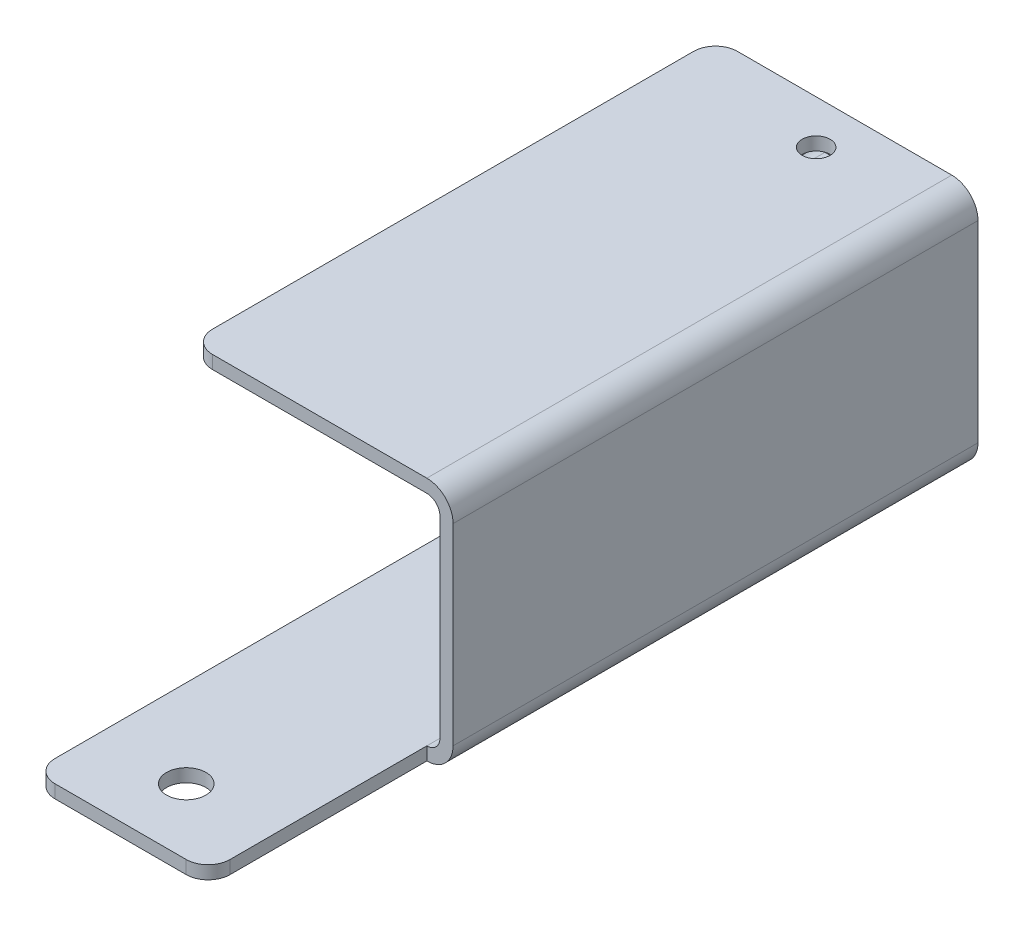
ISO-10303-21;
HEADER;
FILE_DESCRIPTION(('STEP AP214'),'2;1');
FILE_NAME('part.step','',(''),(''),'','','');
FILE_SCHEMA(('AUTOMOTIVE_DESIGN { 1 0 10303 214 1 1 1 1 }'));
ENDSEC;
DATA;
#1=APPLICATION_CONTEXT('core data for automotive mechanical design processes');
#2=APPLICATION_PROTOCOL_DEFINITION('international standard','automotive_design',2000,#1);
#3=PRODUCT_CONTEXT('',#1,'mechanical');
#4=PRODUCT('Part','Part','',(#3));
#5=PRODUCT_RELATED_PRODUCT_CATEGORY('part','',(#4));
#6=PRODUCT_DEFINITION_FORMATION('','',#4);
#7=PRODUCT_DEFINITION_CONTEXT('part definition',#1,'design');
#8=PRODUCT_DEFINITION('design','',#6,#7);
#9=PRODUCT_DEFINITION_SHAPE('','',#8);
#10=(LENGTH_UNIT() NAMED_UNIT(*) SI_UNIT(.MILLI.,.METRE.));
#11=(NAMED_UNIT(*) PLANE_ANGLE_UNIT() SI_UNIT($,.RADIAN.));
#12=(NAMED_UNIT(*) SI_UNIT($,.STERADIAN.) SOLID_ANGLE_UNIT());
#13=UNCERTAINTY_MEASURE_WITH_UNIT(LENGTH_MEASURE(1.E-05),#10,'distance_accuracy_value','');
#14=(GEOMETRIC_REPRESENTATION_CONTEXT(3) GLOBAL_UNCERTAINTY_ASSIGNED_CONTEXT((#13)) GLOBAL_UNIT_ASSIGNED_CONTEXT((#10,
#11,#12)) REPRESENTATION_CONTEXT('',''));
#15=CARTESIAN_POINT('',(0.,0.,0.));
#16=DIRECTION('',(0.,0.,1.));
#17=DIRECTION('',(1.,0.,0.));
#18=AXIS2_PLACEMENT_3D('',#15,#16,#17);
#19=CARTESIAN_POINT('',(13.,0.,-42.5));
#20=DIRECTION('',(0.,0.,1.));
#21=DIRECTION('',(-1.,0.,0.));
#22=AXIS2_PLACEMENT_3D('',#19,#20,#21);
#23=PLANE('',#22);
#24=DIRECTION('',(1.,0.,0.));
#25=VECTOR('',#24,1.);
#26=CARTESIAN_POINT('',(11.5000000000001,23.5,-42.5));
#27=LINE('',#26,#25);
#28=CARTESIAN_POINT('',(11.5000000000001,23.5,-42.5));
#29=VERTEX_POINT('',#28);
#30=CARTESIAN_POINT('',(13.0000000000001,23.5,-42.5));
#31=VERTEX_POINT('',#30);
#32=EDGE_CURVE('E304',#29,#31,#27,.T.);
#33=ORIENTED_EDGE('',*,*,#32,.T.);
#34=DIRECTION('',(0.,-1.,0.));
#35=VECTOR('',#34,1.);
#36=CARTESIAN_POINT('',(13.,0.,-42.5));
#37=LINE('',#36,#35);
#38=CARTESIAN_POINT('',(13.,1.49999999999999,-42.5));
#39=VERTEX_POINT('',#38);
#40=EDGE_CURVE('E312',#31,#39,#37,.T.);
#41=ORIENTED_EDGE('',*,*,#40,.T.);
#42=DIRECTION('',(-1.,0.,0.));
#43=VECTOR('',#42,1.);
#44=CARTESIAN_POINT('',(13.,1.49999999999999,-42.5));
#45=LINE('',#44,#43);
#46=CARTESIAN_POINT('',(11.5,1.49999999999999,-42.5));
#47=VERTEX_POINT('',#46);
#48=EDGE_CURVE('E311',#47,#39,#45,.F.);
#49=ORIENTED_EDGE('',*,*,#48,.F.);
#50=DIRECTION('',(0.,1.,0.));
#51=VECTOR('',#50,1.);
#52=CARTESIAN_POINT('',(11.5,0.,-42.5));
#53=LINE('',#52,#51);
#54=EDGE_CURVE('E316',#29,#47,#53,.F.);
#55=ORIENTED_EDGE('',*,*,#54,.F.);
#56=EDGE_LOOP('',(#33,#41,#49,#55));
#57=FACE_BOUND('',#56,.T.);
#58=ADVANCED_FACE('F39',(#57),#23,.F.);
#59=CARTESIAN_POINT('',(13.,0.,0.));
#60=DIRECTION('',(-1.,0.,0.));
#61=DIRECTION('',(0.,1.,0.));
#62=AXIS2_PLACEMENT_3D('',#59,#60,#61);
#63=PLANE('',#62);
#64=DIRECTION('',(0.,0.,1.));
#65=VECTOR('',#64,1.);
#66=CARTESIAN_POINT('',(13.,1.49999999999999,-42.5));
#67=LINE('',#66,#65);
#68=CARTESIAN_POINT('',(13.0000000000001,1.5,17.5));
#69=VERTEX_POINT('',#68);
#70=EDGE_CURVE('E319',#69,#39,#67,.F.);
#71=ORIENTED_EDGE('',*,*,#70,.T.);
#72=ORIENTED_EDGE('',*,*,#40,.F.);
#73=DIRECTION('',(0.,0.,1.));
#74=VECTOR('',#73,1.);
#75=CARTESIAN_POINT('',(13.0000000000001,23.5,42.5));
#76=LINE('',#75,#74);
#77=CARTESIAN_POINT('',(13.0000000000001,23.5,17.5));
#78=VERTEX_POINT('',#77);
#79=EDGE_CURVE('E297',#78,#31,#76,.F.);
#80=ORIENTED_EDGE('',*,*,#79,.F.);
#81=DIRECTION('',(0.,1.,0.));
#82=VECTOR('',#81,1.);
#83=CARTESIAN_POINT('',(13.0000000000001,0.,17.5));
#84=LINE('',#83,#82);
#85=EDGE_CURVE('E256',#69,#78,#84,.T.);
#86=ORIENTED_EDGE('',*,*,#85,.F.);
#87=EDGE_LOOP('',(#71,#72,#80,#86));
#88=FACE_BOUND('',#87,.T.);
#89=ADVANCED_FACE('F458',(#88),#63,.F.);
#90=CARTESIAN_POINT('',(11.5,0.,0.));
#91=DIRECTION('',(-1.,0.,0.));
#92=DIRECTION('',(0.,1.,0.));
#93=AXIS2_PLACEMENT_3D('',#90,#91,#92);
#94=PLANE('',#93);
#95=DIRECTION('',(0.,1.,0.));
#96=VECTOR('',#95,1.);
#97=CARTESIAN_POINT('',(11.5,0.,17.5));
#98=LINE('',#97,#96);
#99=CARTESIAN_POINT('',(11.5,1.49999999999999,17.5));
#100=VERTEX_POINT('',#99);
#101=CARTESIAN_POINT('',(11.5000000000001,23.5,17.5));
#102=VERTEX_POINT('',#101);
#103=EDGE_CURVE('E266',#100,#102,#98,.T.);
#104=ORIENTED_EDGE('',*,*,#103,.T.);
#105=DIRECTION('',(0.,0.,1.));
#106=VECTOR('',#105,1.);
#107=CARTESIAN_POINT('',(11.5000000000001,23.5,42.5));
#108=LINE('',#107,#106);
#109=EDGE_CURVE('E293',#102,#29,#108,.F.);
#110=ORIENTED_EDGE('',*,*,#109,.T.);
#111=ORIENTED_EDGE('',*,*,#54,.T.);
#112=DIRECTION('',(0.,0.,1.));
#113=VECTOR('',#112,1.);
#114=CARTESIAN_POINT('',(11.5,1.49999999999999,-42.5));
#115=LINE('',#114,#113);
#116=EDGE_CURVE('E322',#47,#100,#115,.T.);
#117=ORIENTED_EDGE('',*,*,#116,.T.);
#118=EDGE_LOOP('',(#104,#110,#111,#117));
#119=FACE_BOUND('',#118,.T.);
#120=ADVANCED_FACE('F433',(#119),#94,.T.);
#121=CARTESIAN_POINT('',(-10.,-1.5,42.5));
#122=DIRECTION('',(-1.,0.,0.));
#123=DIRECTION('',(0.,0.,-1.));
#124=AXIS2_PLACEMENT_3D('',#121,#122,#123);
#125=PLANE('',#124);
#126=DIRECTION('',(0.,0.,-1.));
#127=VECTOR('',#126,1.);
#128=CARTESIAN_POINT('',(-10.,0.,42.5));
#129=LINE('',#128,#127);
#130=CARTESIAN_POINT('',(-10.,0.,40.));
#131=VERTEX_POINT('',#130);
#132=CARTESIAN_POINT('',(-10.,0.,-42.5));
#133=VERTEX_POINT('',#132);
#134=EDGE_CURVE('E350',#131,#133,#129,.T.);
#135=ORIENTED_EDGE('',*,*,#134,.T.);
#136=DIRECTION('',(0.,1.,0.));
#137=VECTOR('',#136,1.);
#138=CARTESIAN_POINT('',(-10.,-1.5,-42.5));
#139=LINE('',#138,#137);
#140=CARTESIAN_POINT('',(-10.,-1.5,-42.5));
#141=VERTEX_POINT('',#140);
#142=EDGE_CURVE('E344',#141,#133,#139,.T.);
#143=ORIENTED_EDGE('',*,*,#142,.F.);
#144=DIRECTION('',(0.,0.,-1.));
#145=VECTOR('',#144,1.);
#146=CARTESIAN_POINT('',(-10.,-1.5,42.5));
#147=LINE('',#146,#145);
#148=CARTESIAN_POINT('',(-10.,-1.5,40.));
#149=VERTEX_POINT('',#148);
#150=EDGE_CURVE('E338',#149,#141,#147,.T.);
#151=ORIENTED_EDGE('',*,*,#150,.F.);
#152=DIRECTION('',(0.,1.,0.));
#153=VECTOR('',#152,1.);
#154=CARTESIAN_POINT('',(-10.,-1.5,40.));
#155=LINE('',#154,#153);
#156=EDGE_CURVE('E375',#131,#149,#155,.F.);
#157=ORIENTED_EDGE('',*,*,#156,.F.);
#158=EDGE_LOOP('',(#135,#143,#151,#157));
#159=FACE_BOUND('',#158,.T.);
#160=ADVANCED_FACE('F484',(#159),#125,.T.);
#161=CARTESIAN_POINT('',(-10.,-1.5,42.5));
#162=DIRECTION('',(0.,0.,1.));
#163=DIRECTION('',(-1.,0.,0.));
#164=AXIS2_PLACEMENT_3D('',#161,#162,#163);
#165=PLANE('',#164);
#166=DIRECTION('',(-1.,0.,0.));
#167=VECTOR('',#166,1.);
#168=CARTESIAN_POINT('',(-10.,0.,42.5));
#169=LINE('',#168,#167);
#170=CARTESIAN_POINT('',(7.5,0.,42.5));
#171=VERTEX_POINT('',#170);
#172=CARTESIAN_POINT('',(-7.5,0.,42.5));
#173=VERTEX_POINT('',#172);
#174=EDGE_CURVE('E347',#171,#173,#169,.T.);
#175=ORIENTED_EDGE('',*,*,#174,.T.);
#176=DIRECTION('',(0.,1.,0.));
#177=VECTOR('',#176,1.);
#178=CARTESIAN_POINT('',(-7.5,-1.5,42.5));
#179=LINE('',#178,#177);
#180=CARTESIAN_POINT('',(-7.5,-1.5,42.5));
#181=VERTEX_POINT('',#180);
#182=EDGE_CURVE('E364',#181,#173,#179,.T.);
#183=ORIENTED_EDGE('',*,*,#182,.F.);
#184=DIRECTION('',(-1.,0.,0.));
#185=VECTOR('',#184,1.);
#186=CARTESIAN_POINT('',(-10.,-1.5,42.5));
#187=LINE('',#186,#185);
#188=CARTESIAN_POINT('',(7.5,-1.5,42.5));
#189=VERTEX_POINT('',#188);
#190=EDGE_CURVE('E334',#189,#181,#187,.T.);
#191=ORIENTED_EDGE('',*,*,#190,.F.);
#192=DIRECTION('',(0.,1.,0.));
#193=VECTOR('',#192,1.);
#194=CARTESIAN_POINT('',(7.5,-1.5,42.5));
#195=LINE('',#194,#193);
#196=EDGE_CURVE('E367',#171,#189,#195,.F.);
#197=ORIENTED_EDGE('',*,*,#196,.F.);
#198=EDGE_LOOP('',(#175,#183,#191,#197));
#199=FACE_BOUND('',#198,.T.);
#200=ADVANCED_FACE('F479',(#199),#165,.T.);
#201=CARTESIAN_POINT('',(0.,-1.5,0.));
#202=DIRECTION('',(0.,1.,0.));
#203=DIRECTION('',(0.,0.,1.));
#204=AXIS2_PLACEMENT_3D('',#201,#202,#203);
#205=PLANE('',#204);
#206=CARTESIAN_POINT('',(0.,-1.5,35.));
#207=DIRECTION('',(0.,-1.,0.));
#208=DIRECTION('',(0.,0.,1.));
#209=AXIS2_PLACEMENT_3D('',#206,#207,#208);
#210=CIRCLE('',#209,2.25);
#211=CARTESIAN_POINT('',(0.,-1.5,37.25));
#212=VERTEX_POINT('',#211);
#213=EDGE_CURVE('E243',#212,#212,#210,.T.);
#214=ORIENTED_EDGE('',*,*,#213,.F.);
#215=EDGE_LOOP('',(#214));
#216=FACE_BOUND('',#215,.T.);
#217=ORIENTED_EDGE('',*,*,#190,.T.);
#218=CARTESIAN_POINT('',(-7.5,-1.5,40.));
#219=DIRECTION('',(0.,-1.,0.));
#220=DIRECTION('',(0.,0.,1.));
#221=AXIS2_PLACEMENT_3D('',#218,#219,#220);
#222=CIRCLE('',#221,2.5);
#223=EDGE_CURVE('E370',#149,#181,#222,.F.);
#224=ORIENTED_EDGE('',*,*,#223,.F.);
#225=ORIENTED_EDGE('',*,*,#150,.T.);
#226=DIRECTION('',(1.,0.,0.));
#227=VECTOR('',#226,1.);
#228=CARTESIAN_POINT('',(-10.,-1.5,-42.5));
#229=LINE('',#228,#227);
#230=CARTESIAN_POINT('',(10.,-1.50000000000002,-42.5));
#231=VERTEX_POINT('',#230);
#232=EDGE_CURVE('E341',#141,#231,#229,.T.);
#233=ORIENTED_EDGE('',*,*,#232,.T.);
#234=DIRECTION('',(0.,0.,1.));
#235=VECTOR('',#234,1.);
#236=CARTESIAN_POINT('',(10.,-1.5,42.5));
#237=LINE('',#236,#235);
#238=CARTESIAN_POINT('',(10.,-1.5,17.5));
#239=VERTEX_POINT('',#238);
#240=EDGE_CURVE('E331',#231,#239,#237,.T.);
#241=ORIENTED_EDGE('',*,*,#240,.T.);
#242=DIRECTION('',(0.,0.,-1.));
#243=VECTOR('',#242,1.);
#244=CARTESIAN_POINT('',(10.,-1.5,42.5));
#245=LINE('',#244,#243);
#246=CARTESIAN_POINT('',(10.,-1.5,40.));
#247=VERTEX_POINT('',#246);
#248=EDGE_CURVE('E246',#247,#239,#245,.T.);
#249=ORIENTED_EDGE('',*,*,#248,.F.);
#250=CARTESIAN_POINT('',(7.5,-1.5,40.));
#251=DIRECTION('',(0.,-1.,0.));
#252=DIRECTION('',(0.,0.,1.));
#253=AXIS2_PLACEMENT_3D('',#250,#251,#252);
#254=CIRCLE('',#253,2.5);
#255=EDGE_CURVE('E372',#189,#247,#254,.F.);
#256=ORIENTED_EDGE('',*,*,#255,.F.);
#257=EDGE_LOOP('',(#217,#224,#225,#233,#241,#249,#256));
#258=FACE_BOUND('',#257,.T.);
#259=ADVANCED_FACE('F476',(#216,#258),#205,.F.);
#260=CARTESIAN_POINT('',(0.,0.,0.));
#261=DIRECTION('',(0.,1.,0.));
#262=DIRECTION('',(0.,0.,1.));
#263=AXIS2_PLACEMENT_3D('',#260,#261,#262);
#264=PLANE('',#263);
#265=CARTESIAN_POINT('',(0.,0.,35.));
#266=DIRECTION('',(0.,-1.,0.));
#267=DIRECTION('',(0.,0.,1.));
#268=AXIS2_PLACEMENT_3D('',#265,#266,#267);
#269=CIRCLE('',#268,2.25);
#270=CARTESIAN_POINT('',(0.,0.,37.25));
#271=VERTEX_POINT('',#270);
#272=EDGE_CURVE('E235',#271,#271,#269,.T.);
#273=ORIENTED_EDGE('',*,*,#272,.T.);
#274=EDGE_LOOP('',(#273));
#275=FACE_BOUND('',#274,.T.);
#276=DIRECTION('',(0.,0.,-1.));
#277=VECTOR('',#276,1.);
#278=CARTESIAN_POINT('',(10.,0.,0.));
#279=LINE('',#278,#277);
#280=CARTESIAN_POINT('',(10.,0.,40.));
#281=VERTEX_POINT('',#280);
#282=CARTESIAN_POINT('',(10.,0.,17.5));
#283=VERTEX_POINT('',#282);
#284=EDGE_CURVE('E253',#281,#283,#279,.T.);
#285=ORIENTED_EDGE('',*,*,#284,.T.);
#286=DIRECTION('',(0.,0.,1.));
#287=VECTOR('',#286,1.);
#288=CARTESIAN_POINT('',(10.,0.,42.5));
#289=LINE('',#288,#287);
#290=CARTESIAN_POINT('',(10.,0.,-42.5));
#291=VERTEX_POINT('',#290);
#292=EDGE_CURVE('E329',#291,#283,#289,.T.);
#293=ORIENTED_EDGE('',*,*,#292,.F.);
#294=DIRECTION('',(1.,0.,0.));
#295=VECTOR('',#294,1.);
#296=CARTESIAN_POINT('',(-10.,0.,-42.5));
#297=LINE('',#296,#295);
#298=EDGE_CURVE('E335',#133,#291,#297,.T.);
#299=ORIENTED_EDGE('',*,*,#298,.F.);
#300=ORIENTED_EDGE('',*,*,#134,.F.);
#301=CARTESIAN_POINT('',(-7.5,0.,40.));
#302=DIRECTION('',(0.,-1.,0.));
#303=DIRECTION('',(0.,0.,1.));
#304=AXIS2_PLACEMENT_3D('',#301,#302,#303);
#305=CIRCLE('',#304,2.5);
#306=EDGE_CURVE('E360',#173,#131,#305,.T.);
#307=ORIENTED_EDGE('',*,*,#306,.F.);
#308=ORIENTED_EDGE('',*,*,#174,.F.);
#309=CARTESIAN_POINT('',(7.5,0.,40.));
#310=DIRECTION('',(0.,-1.,0.));
#311=DIRECTION('',(0.,0.,1.));
#312=AXIS2_PLACEMENT_3D('',#309,#310,#311);
#313=CIRCLE('',#312,2.5);
#314=EDGE_CURVE('E362',#281,#171,#313,.T.);
#315=ORIENTED_EDGE('',*,*,#314,.F.);
#316=EDGE_LOOP('',(#285,#293,#299,#300,#307,#308,#315));
#317=FACE_BOUND('',#316,.T.);
#318=ADVANCED_FACE('F475',(#275,#317),#264,.T.);
#319=CARTESIAN_POINT('',(10.,1.5,-42.5));
#320=DIRECTION('',(0.,0.,-1.));
#321=DIRECTION('',(1.,0.,0.));
#322=AXIS2_PLACEMENT_3D('',#319,#320,#321);
#323=PLANE('',#322);
#324=ORIENTED_EDGE('',*,*,#48,.T.);
#325=CARTESIAN_POINT('',(10.,1.5,-42.5));
#326=DIRECTION('',(0.,0.,-1.));
#327=DIRECTION('',(-1.,0.,0.));
#328=AXIS2_PLACEMENT_3D('',#325,#326,#327);
#329=CIRCLE('',#328,3.);
#330=EDGE_CURVE('E327',#231,#39,#329,.F.);
#331=ORIENTED_EDGE('',*,*,#330,.F.);
#332=DIRECTION('',(0.,1.,0.));
#333=VECTOR('',#332,1.);
#334=CARTESIAN_POINT('',(10.,-1.5,-42.5));
#335=LINE('',#334,#333);
#336=EDGE_CURVE('E231',#231,#291,#335,.T.);
#337=ORIENTED_EDGE('',*,*,#336,.T.);
#338=CARTESIAN_POINT('',(10.,1.5,-42.5));
#339=DIRECTION('',(0.,0.,-1.));
#340=DIRECTION('',(-1.,0.,0.));
#341=AXIS2_PLACEMENT_3D('',#338,#339,#340);
#342=CIRCLE('',#341,1.5);
#343=EDGE_CURVE('E315',#291,#47,#342,.F.);
#344=ORIENTED_EDGE('',*,*,#343,.T.);
#345=EDGE_LOOP('',(#324,#331,#337,#344));
#346=FACE_BOUND('',#345,.T.);
#347=ADVANCED_FACE('F438',(#346),#323,.T.);
#348=CARTESIAN_POINT('',(10.,1.5,42.5));
#349=DIRECTION('',(0.,0.,1.));
#350=DIRECTION('',(1.,0.,0.));
#351=AXIS2_PLACEMENT_3D('',#348,#349,#350);
#352=CYLINDRICAL_SURFACE('',#351,3.);
#353=ORIENTED_EDGE('',*,*,#240,.F.);
#354=ORIENTED_EDGE('',*,*,#330,.T.);
#355=ORIENTED_EDGE('',*,*,#70,.F.);
#356=CARTESIAN_POINT('',(10.,1.5,17.5));
#357=DIRECTION('',(0.,0.,1.));
#358=DIRECTION('',(1.,0.,0.));
#359=AXIS2_PLACEMENT_3D('',#356,#357,#358);
#360=CIRCLE('',#359,3.);
#361=EDGE_CURVE('E274',#69,#239,#360,.F.);
#362=ORIENTED_EDGE('',*,*,#361,.T.);
#363=EDGE_LOOP('',(#353,#354,#355,#362));
#364=FACE_BOUND('',#363,.T.);
#365=ADVANCED_FACE('F467',(#364),#352,.T.);
#366=CARTESIAN_POINT('',(10.,1.5,42.5));
#367=DIRECTION('',(0.,0.,1.));
#368=DIRECTION('',(1.,0.,0.));
#369=AXIS2_PLACEMENT_3D('',#366,#367,#368);
#370=CYLINDRICAL_SURFACE('',#369,1.5);
#371=ORIENTED_EDGE('',*,*,#116,.F.);
#372=ORIENTED_EDGE('',*,*,#343,.F.);
#373=ORIENTED_EDGE('',*,*,#292,.T.);
#374=CARTESIAN_POINT('',(10.,1.5,17.5));
#375=DIRECTION('',(0.,0.,1.));
#376=DIRECTION('',(1.,0.,0.));
#377=AXIS2_PLACEMENT_3D('',#374,#375,#376);
#378=CIRCLE('',#377,1.5);
#379=EDGE_CURVE('E269',#100,#283,#378,.F.);
#380=ORIENTED_EDGE('',*,*,#379,.F.);
#381=EDGE_LOOP('',(#371,#372,#373,#380));
#382=FACE_BOUND('',#381,.T.);
#383=ADVANCED_FACE('F443',(#382),#370,.F.);
#384=CARTESIAN_POINT('',(10.0000000000001,23.5,-42.5));
#385=DIRECTION('',(0.,0.,-1.));
#386=DIRECTION('',(1.,0.,0.));
#387=AXIS2_PLACEMENT_3D('',#384,#385,#386);
#388=PLANE('',#387);
#389=DIRECTION('',(0.,1.,0.));
#390=VECTOR('',#389,1.);
#391=CARTESIAN_POINT('',(10.0000000000001,25.,-42.5));
#392=LINE('',#391,#390);
#393=CARTESIAN_POINT('',(10.0000000000001,25.,-42.5));
#394=VERTEX_POINT('',#393);
#395=CARTESIAN_POINT('',(10.0000000000001,26.5,-42.4999999999999));
#396=VERTEX_POINT('',#395);
#397=EDGE_CURVE('E277',#394,#396,#392,.T.);
#398=ORIENTED_EDGE('',*,*,#397,.T.);
#399=CARTESIAN_POINT('',(10.0000000000001,23.5,-42.4999999999999));
#400=DIRECTION('',(0.,0.,-1.));
#401=DIRECTION('',(-1.,0.,0.));
#402=AXIS2_PLACEMENT_3D('',#399,#400,#401);
#403=CIRCLE('',#402,3.);
#404=EDGE_CURVE('E300',#31,#396,#403,.F.);
#405=ORIENTED_EDGE('',*,*,#404,.F.);
#406=ORIENTED_EDGE('',*,*,#32,.F.);
#407=CARTESIAN_POINT('',(10.0000000000001,23.5,-42.5));
#408=DIRECTION('',(0.,0.,-1.));
#409=DIRECTION('',(-1.,0.,0.));
#410=AXIS2_PLACEMENT_3D('',#407,#408,#409);
#411=CIRCLE('',#410,1.5);
#412=EDGE_CURVE('E301',#29,#394,#411,.F.);
#413=ORIENTED_EDGE('',*,*,#412,.T.);
#414=EDGE_LOOP('',(#398,#405,#406,#413));
#415=FACE_BOUND('',#414,.T.);
#416=ADVANCED_FACE('F425',(#415),#388,.T.);
#417=CARTESIAN_POINT('',(10.0000000000001,23.5,42.5));
#418=DIRECTION('',(0.,0.,1.));
#419=DIRECTION('',(0.,1.,0.));
#420=AXIS2_PLACEMENT_3D('',#417,#418,#419);
#421=CYLINDRICAL_SURFACE('',#420,3.);
#422=CARTESIAN_POINT('',(10.0000000000001,23.5,17.5));
#423=DIRECTION('',(0.,0.,1.));
#424=DIRECTION('',(1.,0.,0.));
#425=AXIS2_PLACEMENT_3D('',#422,#423,#424);
#426=CIRCLE('',#425,3.);
#427=CARTESIAN_POINT('',(10.0000000000001,26.5000000000002,17.5));
#428=VERTEX_POINT('',#427);
#429=EDGE_CURVE('E272',#428,#78,#426,.F.);
#430=ORIENTED_EDGE('',*,*,#429,.T.);
#431=ORIENTED_EDGE('',*,*,#79,.T.);
#432=ORIENTED_EDGE('',*,*,#404,.T.);
#433=DIRECTION('',(0.,0.,-1.));
#434=VECTOR('',#433,1.);
#435=CARTESIAN_POINT('',(10.0000000000001,26.5,0.));
#436=LINE('',#435,#434);
#437=EDGE_CURVE('E281',#428,#396,#436,.T.);
#438=ORIENTED_EDGE('',*,*,#437,.F.);
#439=EDGE_LOOP('',(#430,#431,#432,#438));
#440=FACE_BOUND('',#439,.T.);
#441=ADVANCED_FACE('F420',(#440),#421,.T.);
#442=CARTESIAN_POINT('',(10.0000000000001,23.5,42.5));
#443=DIRECTION('',(0.,0.,1.));
#444=DIRECTION('',(0.,1.,0.));
#445=AXIS2_PLACEMENT_3D('',#442,#443,#444);
#446=CYLINDRICAL_SURFACE('',#445,1.5);
#447=DIRECTION('',(0.,0.,1.));
#448=VECTOR('',#447,1.);
#449=CARTESIAN_POINT('',(10.0000000000001,25.,-42.5));
#450=LINE('',#449,#448);
#451=CARTESIAN_POINT('',(10.0000000000001,25.,17.5));
#452=VERTEX_POINT('',#451);
#453=EDGE_CURVE('E278',#394,#452,#450,.T.);
#454=ORIENTED_EDGE('',*,*,#453,.F.);
#455=ORIENTED_EDGE('',*,*,#412,.F.);
#456=ORIENTED_EDGE('',*,*,#109,.F.);
#457=CARTESIAN_POINT('',(10.0000000000001,23.5,17.5));
#458=DIRECTION('',(0.,0.,1.));
#459=DIRECTION('',(1.,0.,0.));
#460=AXIS2_PLACEMENT_3D('',#457,#458,#459);
#461=CIRCLE('',#460,1.5);
#462=EDGE_CURVE('E264',#452,#102,#461,.F.);
#463=ORIENTED_EDGE('',*,*,#462,.F.);
#464=EDGE_LOOP('',(#454,#455,#456,#463));
#465=FACE_BOUND('',#464,.T.);
#466=ADVANCED_FACE('F429',(#465),#446,.F.);
#467=CARTESIAN_POINT('',(11.5000000000001,26.5,-42.5));
#468=DIRECTION('',(0.,0.,1.));
#469=DIRECTION('',(-1.,0.,0.));
#470=AXIS2_PLACEMENT_3D('',#467,#468,#469);
#471=PLANE('',#470);
#472=DIRECTION('',(1.,0.,0.));
#473=VECTOR('',#472,1.);
#474=CARTESIAN_POINT('',(11.5000000000001,26.5,-42.5));
#475=LINE('',#474,#473);
#476=CARTESIAN_POINT('',(-14.4999999999999,26.5000000000002,-42.5));
#477=VERTEX_POINT('',#476);
#478=EDGE_CURVE('E290',#477,#396,#475,.T.);
#479=ORIENTED_EDGE('',*,*,#478,.T.);
#480=ORIENTED_EDGE('',*,*,#397,.F.);
#481=DIRECTION('',(1.,0.,0.));
#482=VECTOR('',#481,1.);
#483=CARTESIAN_POINT('',(11.5000000000001,25.,-42.5));
#484=LINE('',#483,#482);
#485=CARTESIAN_POINT('',(-14.4999999999999,25.0000000000002,-42.5));
#486=VERTEX_POINT('',#485);
#487=EDGE_CURVE('E291',#486,#394,#484,.T.);
#488=ORIENTED_EDGE('',*,*,#487,.F.);
#489=DIRECTION('',(0.,-1.,0.));
#490=VECTOR('',#489,1.);
#491=CARTESIAN_POINT('',(-14.4999999999999,26.5000000000002,-42.5));
#492=LINE('',#491,#490);
#493=EDGE_CURVE('E395',#477,#486,#492,.T.);
#494=ORIENTED_EDGE('',*,*,#493,.F.);
#495=EDGE_LOOP('',(#479,#480,#488,#494));
#496=FACE_BOUND('',#495,.T.);
#497=ADVANCED_FACE('F413',(#496),#471,.F.);
#498=CARTESIAN_POINT('',(1.83913740033876E-13,26.5000000000001,0.));
#499=DIRECTION('',(0.,-1.,0.));
#500=DIRECTION('',(-1.,0.,0.));
#501=AXIS2_PLACEMENT_3D('',#498,#499,#500);
#502=PLANE('',#501);
#503=CARTESIAN_POINT('',(-0.499999999999813,26.5000000000001,-37.5));
#504=DIRECTION('',(0.,-1.,0.));
#505=DIRECTION('',(1.,0.,0.));
#506=AXIS2_PLACEMENT_3D('',#503,#504,#505);
#507=CIRCLE('',#506,1.6);
#508=CARTESIAN_POINT('',(1.10000000000019,26.5000000000001,-37.5));
#509=VERTEX_POINT('',#508);
#510=EDGE_CURVE('E524',#509,#509,#507,.T.);
#511=ORIENTED_EDGE('',*,*,#510,.T.);
#512=EDGE_LOOP('',(#511));
#513=FACE_BOUND('',#512,.T.);
#514=DIRECTION('',(0.,0.,-1.));
#515=VECTOR('',#514,1.);
#516=CARTESIAN_POINT('',(-16.9999999999999,26.5000000000002,-42.5));
#517=LINE('',#516,#515);
#518=CARTESIAN_POINT('',(-16.9999999999999,26.5000000000002,15.));
#519=VERTEX_POINT('',#518);
#520=CARTESIAN_POINT('',(-16.9999999999999,26.5000000000002,-40.));
#521=VERTEX_POINT('',#520);
#522=EDGE_CURVE('E287',#519,#521,#517,.T.);
#523=ORIENTED_EDGE('',*,*,#522,.F.);
#524=CARTESIAN_POINT('',(-14.4999999999999,26.5000000000002,15.));
#525=DIRECTION('',(0.,1.,0.));
#526=DIRECTION('',(-1.,0.,0.));
#527=AXIS2_PLACEMENT_3D('',#524,#525,#526);
#528=CIRCLE('',#527,2.5);
#529=CARTESIAN_POINT('',(-14.4999999999999,26.5000000000002,17.5));
#530=VERTEX_POINT('',#529);
#531=EDGE_CURVE('E405',#530,#519,#528,.F.);
#532=ORIENTED_EDGE('',*,*,#531,.F.);
#533=DIRECTION('',(-1.,0.,0.));
#534=VECTOR('',#533,1.);
#535=CARTESIAN_POINT('',(13.0000000000001,26.5000000000002,17.5));
#536=LINE('',#535,#534);
#537=EDGE_CURVE('E259',#428,#530,#536,.T.);
#538=ORIENTED_EDGE('',*,*,#537,.F.);
#539=ORIENTED_EDGE('',*,*,#437,.T.);
#540=ORIENTED_EDGE('',*,*,#478,.F.);
#541=CARTESIAN_POINT('',(-14.4999999999999,26.5000000000002,-40.));
#542=DIRECTION('',(0.,1.,0.));
#543=DIRECTION('',(-1.,0.,0.));
#544=AXIS2_PLACEMENT_3D('',#541,#542,#543);
#545=CIRCLE('',#544,2.5);
#546=EDGE_CURVE('E47',#521,#477,#545,.F.);
#547=ORIENTED_EDGE('',*,*,#546,.F.);
#548=EDGE_LOOP('',(#523,#532,#538,#539,#540,#547));
#549=FACE_BOUND('',#548,.T.);
#550=ADVANCED_FACE('F415',(#513,#549),#502,.F.);
#551=CARTESIAN_POINT('',(1.73472347597681E-13,25.0000000000001,0.));
#552=DIRECTION('',(0.,-1.,0.));
#553=DIRECTION('',(-1.,0.,0.));
#554=AXIS2_PLACEMENT_3D('',#551,#552,#553);
#555=PLANE('',#554);
#556=CARTESIAN_POINT('',(-0.499999999999823,25.0000000000001,-37.5));
#557=DIRECTION('',(0.,1.,0.));
#558=DIRECTION('',(-1.,0.,0.));
#559=AXIS2_PLACEMENT_3D('',#556,#557,#558);
#560=CIRCLE('',#559,1.6);
#561=CARTESIAN_POINT('',(1.10000000000017,25.0000000000001,-37.5));
#562=VERTEX_POINT('',#561);
#563=EDGE_CURVE('E527',#562,#562,#560,.F.);
#564=ORIENTED_EDGE('',*,*,#563,.F.);
#565=EDGE_LOOP('',(#564));
#566=FACE_BOUND('',#565,.T.);
#567=ORIENTED_EDGE('',*,*,#487,.T.);
#568=ORIENTED_EDGE('',*,*,#453,.T.);
#569=DIRECTION('',(-1.,0.,0.));
#570=VECTOR('',#569,1.);
#571=CARTESIAN_POINT('',(1.73472347597681E-13,25.0000000000001,17.5));
#572=LINE('',#571,#570);
#573=CARTESIAN_POINT('',(-14.4999999999999,25.0000000000002,17.5));
#574=VERTEX_POINT('',#573);
#575=EDGE_CURVE('E261',#452,#574,#572,.T.);
#576=ORIENTED_EDGE('',*,*,#575,.T.);
#577=CARTESIAN_POINT('',(-14.4999999999999,25.0000000000002,15.));
#578=DIRECTION('',(0.,1.,0.));
#579=DIRECTION('',(-1.,0.,0.));
#580=AXIS2_PLACEMENT_3D('',#577,#578,#579);
#581=CIRCLE('',#580,2.5);
#582=CARTESIAN_POINT('',(-16.9999999999999,25.0000000000002,15.));
#583=VERTEX_POINT('',#582);
#584=EDGE_CURVE('E398',#583,#574,#581,.T.);
#585=ORIENTED_EDGE('',*,*,#584,.F.);
#586=DIRECTION('',(0.,0.,-1.));
#587=VECTOR('',#586,1.);
#588=CARTESIAN_POINT('',(-16.9999999999999,25.0000000000002,-42.5));
#589=LINE('',#588,#587);
#590=CARTESIAN_POINT('',(-16.9999999999999,25.0000000000002,-40.));
#591=VERTEX_POINT('',#590);
#592=EDGE_CURVE('E286',#583,#591,#589,.T.);
#593=ORIENTED_EDGE('',*,*,#592,.T.);
#594=CARTESIAN_POINT('',(-14.4999999999999,25.0000000000002,-40.));
#595=DIRECTION('',(0.,1.,0.));
#596=DIRECTION('',(-1.,0.,0.));
#597=AXIS2_PLACEMENT_3D('',#594,#595,#596);
#598=CIRCLE('',#597,2.5);
#599=EDGE_CURVE('E400',#486,#591,#598,.T.);
#600=ORIENTED_EDGE('',*,*,#599,.F.);
#601=EDGE_LOOP('',(#567,#568,#576,#585,#593,#600));
#602=FACE_BOUND('',#601,.T.);
#603=ADVANCED_FACE('F447',(#566,#602),#555,.T.);
#604=CARTESIAN_POINT('',(-16.9999999999999,26.5000000000002,-42.5));
#605=DIRECTION('',(1.,0.,0.));
#606=DIRECTION('',(0.,-1.,0.));
#607=AXIS2_PLACEMENT_3D('',#604,#605,#606);
#608=PLANE('',#607);
#609=ORIENTED_EDGE('',*,*,#592,.F.);
#610=DIRECTION('',(0.,-1.,0.));
#611=VECTOR('',#610,1.);
#612=CARTESIAN_POINT('',(-16.9999999999999,26.5000000000002,15.));
#613=LINE('',#612,#611);
#614=EDGE_CURVE('E402',#519,#583,#613,.T.);
#615=ORIENTED_EDGE('',*,*,#614,.F.);
#616=ORIENTED_EDGE('',*,*,#522,.T.);
#617=DIRECTION('',(0.,-1.,0.));
#618=VECTOR('',#617,1.);
#619=CARTESIAN_POINT('',(-16.9999999999999,26.5000000000002,-40.));
#620=LINE('',#619,#618);
#621=EDGE_CURVE('E60',#591,#521,#620,.F.);
#622=ORIENTED_EDGE('',*,*,#621,.F.);
#623=EDGE_LOOP('',(#609,#615,#616,#622));
#624=FACE_BOUND('',#623,.T.);
#625=ADVANCED_FACE('F451',(#624),#608,.F.);
#626=CARTESIAN_POINT('',(13.0000000000001,0.,17.5));
#627=DIRECTION('',(0.,0.,-1.));
#628=DIRECTION('',(1.,0.,0.));
#629=AXIS2_PLACEMENT_3D('',#626,#627,#628);
#630=PLANE('',#629);
#631=ORIENTED_EDGE('',*,*,#575,.F.);
#632=ORIENTED_EDGE('',*,*,#462,.T.);
#633=ORIENTED_EDGE('',*,*,#103,.F.);
#634=ORIENTED_EDGE('',*,*,#379,.T.);
#635=DIRECTION('',(0.,1.,0.));
#636=VECTOR('',#635,1.);
#637=CARTESIAN_POINT('',(10.,-1.5,17.5));
#638=LINE('',#637,#636);
#639=EDGE_CURVE('E251',#239,#283,#638,.T.);
#640=ORIENTED_EDGE('',*,*,#639,.F.);
#641=ORIENTED_EDGE('',*,*,#361,.F.);
#642=ORIENTED_EDGE('',*,*,#85,.T.);
#643=ORIENTED_EDGE('',*,*,#429,.F.);
#644=ORIENTED_EDGE('',*,*,#537,.T.);
#645=DIRECTION('',(0.,-1.,0.));
#646=VECTOR('',#645,1.);
#647=CARTESIAN_POINT('',(-14.5000000000001,1.91425527996912E-13,17.5));
#648=LINE('',#647,#646);
#649=EDGE_CURVE('E11',#574,#530,#648,.F.);
#650=ORIENTED_EDGE('',*,*,#649,.F.);
#651=EDGE_LOOP('',(#631,#632,#633,#634,#640,#641,#642,#643,#644,#650));
#652=FACE_BOUND('',#651,.T.);
#653=ADVANCED_FACE('F445',(#652),#630,.F.);
#654=CARTESIAN_POINT('',(10.,-1.5,42.5));
#655=DIRECTION('',(-1.,0.,0.));
#656=DIRECTION('',(0.,0.,-1.));
#657=AXIS2_PLACEMENT_3D('',#654,#655,#656);
#658=PLANE('',#657);
#659=ORIENTED_EDGE('',*,*,#248,.T.);
#660=ORIENTED_EDGE('',*,*,#639,.T.);
#661=ORIENTED_EDGE('',*,*,#284,.F.);
#662=DIRECTION('',(0.,1.,0.));
#663=VECTOR('',#662,1.);
#664=CARTESIAN_POINT('',(10.,0.,40.));
#665=LINE('',#664,#663);
#666=EDGE_CURVE('E356',#247,#281,#665,.T.);
#667=ORIENTED_EDGE('',*,*,#666,.F.);
#668=EDGE_LOOP('',(#659,#660,#661,#667));
#669=FACE_BOUND('',#668,.T.);
#670=ADVANCED_FACE('F554',(#669),#658,.F.);
#671=CARTESIAN_POINT('',(0.,-1.5,35.));
#672=DIRECTION('',(0.,1.,0.));
#673=DIRECTION('',(0.,0.,1.));
#674=AXIS2_PLACEMENT_3D('',#671,#672,#673);
#675=CYLINDRICAL_SURFACE('',#674,2.25);
#676=ORIENTED_EDGE('',*,*,#213,.T.);
#677=EDGE_LOOP('',(#676));
#678=FACE_BOUND('',#677,.T.);
#679=ORIENTED_EDGE('',*,*,#272,.F.);
#680=EDGE_LOOP('',(#679));
#681=FACE_BOUND('',#680,.T.);
#682=ADVANCED_FACE('F563',(#678,#681),#675,.F.);
#683=CARTESIAN_POINT('',(-10.,1.49999999999998,-42.5));
#684=DIRECTION('',(-1.,0.,0.));
#685=DIRECTION('',(0.,0.,-1.));
#686=AXIS2_PLACEMENT_3D('',#683,#684,#685);
#687=PLANE('',#686);
#688=DIRECTION('',(0.,0.,1.));
#689=VECTOR('',#688,1.);
#690=CARTESIAN_POINT('',(-10.,1.5,-45.5));
#691=LINE('',#690,#689);
#692=CARTESIAN_POINT('',(-10.,1.49999999999998,-44.));
#693=VERTEX_POINT('',#692);
#694=CARTESIAN_POINT('',(-10.,1.49999999999997,-45.5));
#695=VERTEX_POINT('',#694);
#696=EDGE_CURVE('E523',#693,#695,#691,.F.);
#697=ORIENTED_EDGE('',*,*,#696,.T.);
#698=CARTESIAN_POINT('',(-10.,1.49999999999998,-42.5));
#699=DIRECTION('',(-1.,0.,0.));
#700=DIRECTION('',(0.,0.,1.));
#701=AXIS2_PLACEMENT_3D('',#698,#699,#700);
#702=CIRCLE('',#701,3.);
#703=EDGE_CURVE('E215',#141,#695,#702,.F.);
#704=ORIENTED_EDGE('',*,*,#703,.F.);
#705=ORIENTED_EDGE('',*,*,#142,.T.);
#706=CARTESIAN_POINT('',(-10.,1.49999999999998,-42.5));
#707=DIRECTION('',(-1.,0.,0.));
#708=DIRECTION('',(0.,0.,1.));
#709=AXIS2_PLACEMENT_3D('',#706,#707,#708);
#710=CIRCLE('',#709,1.5);
#711=EDGE_CURVE('E233',#133,#693,#710,.F.);
#712=ORIENTED_EDGE('',*,*,#711,.T.);
#713=EDGE_LOOP('',(#697,#704,#705,#712));
#714=FACE_BOUND('',#713,.T.);
#715=ADVANCED_FACE('F543',(#714),#687,.T.);
#716=CARTESIAN_POINT('',(10.,1.49999999999998,-42.5));
#717=DIRECTION('',(-1.,0.,0.));
#718=DIRECTION('',(0.,0.,-1.));
#719=AXIS2_PLACEMENT_3D('',#716,#717,#718);
#720=PLANE('',#719);
#721=CARTESIAN_POINT('',(10.,1.49999999999998,-42.5));
#722=DIRECTION('',(-1.,0.,0.));
#723=DIRECTION('',(0.,0.,1.));
#724=AXIS2_PLACEMENT_3D('',#721,#722,#723);
#725=CIRCLE('',#724,1.5);
#726=CARTESIAN_POINT('',(10.,1.49999999999998,-44.));
#727=VERTEX_POINT('',#726);
#728=EDGE_CURVE('E238',#727,#291,#725,.T.);
#729=ORIENTED_EDGE('',*,*,#728,.T.);
#730=ORIENTED_EDGE('',*,*,#336,.F.);
#731=CARTESIAN_POINT('',(10.,1.49999999999998,-42.5));
#732=DIRECTION('',(-1.,0.,0.));
#733=DIRECTION('',(0.,0.,1.));
#734=AXIS2_PLACEMENT_3D('',#731,#732,#733);
#735=CIRCLE('',#734,3.);
#736=CARTESIAN_POINT('',(10.,1.5,-45.5));
#737=VERTEX_POINT('',#736);
#738=EDGE_CURVE('E213',#737,#231,#735,.T.);
#739=ORIENTED_EDGE('',*,*,#738,.F.);
#740=DIRECTION('',(0.,0.,1.));
#741=VECTOR('',#740,1.);
#742=CARTESIAN_POINT('',(10.,1.49999999999999,-44.));
#743=LINE('',#742,#741);
#744=EDGE_CURVE('E218',#727,#737,#743,.F.);
#745=ORIENTED_EDGE('',*,*,#744,.F.);
#746=EDGE_LOOP('',(#729,#730,#739,#745));
#747=FACE_BOUND('',#746,.T.);
#748=ADVANCED_FACE('F229',(#747),#720,.F.);
#749=CARTESIAN_POINT('',(10.,1.49999999999998,-42.5));
#750=DIRECTION('',(1.,0.,0.));
#751=DIRECTION('',(0.,0.,-1.));
#752=AXIS2_PLACEMENT_3D('',#749,#750,#751);
#753=CYLINDRICAL_SURFACE('',#752,3.);
#754=ORIENTED_EDGE('',*,*,#232,.F.);
#755=ORIENTED_EDGE('',*,*,#703,.T.);
#756=DIRECTION('',(1.,0.,0.));
#757=VECTOR('',#756,1.);
#758=CARTESIAN_POINT('',(-10.,1.5,-45.5));
#759=LINE('',#758,#757);
#760=EDGE_CURVE('E197',#737,#695,#759,.F.);
#761=ORIENTED_EDGE('',*,*,#760,.F.);
#762=ORIENTED_EDGE('',*,*,#738,.T.);
#763=EDGE_LOOP('',(#754,#755,#761,#762));
#764=FACE_BOUND('',#763,.T.);
#765=ADVANCED_FACE('F211',(#764),#753,.T.);
#766=CARTESIAN_POINT('',(10.,1.49999999999998,-42.5));
#767=DIRECTION('',(1.,0.,0.));
#768=DIRECTION('',(0.,0.,-1.));
#769=AXIS2_PLACEMENT_3D('',#766,#767,#768);
#770=CYLINDRICAL_SURFACE('',#769,1.5);
#771=ORIENTED_EDGE('',*,*,#298,.T.);
#772=ORIENTED_EDGE('',*,*,#728,.F.);
#773=DIRECTION('',(1.,0.,0.));
#774=VECTOR('',#773,1.);
#775=CARTESIAN_POINT('',(-10.,1.49999999999999,-44.));
#776=LINE('',#775,#774);
#777=EDGE_CURVE('E227',#693,#727,#776,.T.);
#778=ORIENTED_EDGE('',*,*,#777,.F.);
#779=ORIENTED_EDGE('',*,*,#711,.F.);
#780=EDGE_LOOP('',(#771,#772,#778,#779));
#781=FACE_BOUND('',#780,.T.);
#782=ADVANCED_FACE('F541',(#781),#770,.F.);
#783=CARTESIAN_POINT('',(-10.,0.,-45.5));
#784=DIRECTION('',(1.,0.,0.));
#785=DIRECTION('',(0.,0.,1.));
#786=AXIS2_PLACEMENT_3D('',#783,#784,#785);
#787=PLANE('',#786);
#788=DIRECTION('',(0.,-1.,0.));
#789=VECTOR('',#788,1.);
#790=CARTESIAN_POINT('',(-10.,-1.48703541913374E-13,-45.5));
#791=LINE('',#790,#789);
#792=CARTESIAN_POINT('',(-10.,16.,-45.5000000000001));
#793=VERTEX_POINT('',#792);
#794=EDGE_CURVE('E207',#793,#695,#791,.T.);
#795=ORIENTED_EDGE('',*,*,#794,.T.);
#796=ORIENTED_EDGE('',*,*,#696,.F.);
#797=DIRECTION('',(0.,1.,0.));
#798=VECTOR('',#797,1.);
#799=CARTESIAN_POINT('',(-10.,0.,-44.));
#800=LINE('',#799,#798);
#801=CARTESIAN_POINT('',(-10.,16.,-44.));
#802=VERTEX_POINT('',#801);
#803=EDGE_CURVE('E217',#802,#693,#800,.F.);
#804=ORIENTED_EDGE('',*,*,#803,.F.);
#805=DIRECTION('',(0.,0.,1.));
#806=VECTOR('',#805,1.);
#807=CARTESIAN_POINT('',(-10.,16.,-45.5000000000001));
#808=LINE('',#807,#806);
#809=EDGE_CURVE('E392',#793,#802,#808,.T.);
#810=ORIENTED_EDGE('',*,*,#809,.F.);
#811=EDGE_LOOP('',(#795,#796,#804,#810));
#812=FACE_BOUND('',#811,.T.);
#813=ADVANCED_FACE('F513',(#812),#787,.F.);
#814=CARTESIAN_POINT('',(10.,18.5,-45.5000000000001));
#815=DIRECTION('',(-1.,0.,0.));
#816=DIRECTION('',(0.,0.,-1.));
#817=AXIS2_PLACEMENT_3D('',#814,#815,#816);
#818=PLANE('',#817);
#819=DIRECTION('',(0.,-1.,0.));
#820=VECTOR('',#819,1.);
#821=CARTESIAN_POINT('',(10.,18.5,-44.0000000000001));
#822=LINE('',#821,#820);
#823=CARTESIAN_POINT('',(10.,16.,-44.));
#824=VERTEX_POINT('',#823);
#825=EDGE_CURVE('E223',#727,#824,#822,.F.);
#826=ORIENTED_EDGE('',*,*,#825,.F.);
#827=ORIENTED_EDGE('',*,*,#744,.T.);
#828=DIRECTION('',(0.,1.,0.));
#829=VECTOR('',#828,1.);
#830=CARTESIAN_POINT('',(10.,-1.48703541913374E-13,-45.5));
#831=LINE('',#830,#829);
#832=CARTESIAN_POINT('',(10.,16.,-45.5000000000001));
#833=VERTEX_POINT('',#832);
#834=EDGE_CURVE('E193',#737,#833,#831,.T.);
#835=ORIENTED_EDGE('',*,*,#834,.T.);
#836=DIRECTION('',(0.,0.,1.));
#837=VECTOR('',#836,1.);
#838=CARTESIAN_POINT('',(10.,16.,-45.5000000000001));
#839=LINE('',#838,#837);
#840=EDGE_CURVE('E387',#824,#833,#839,.F.);
#841=ORIENTED_EDGE('',*,*,#840,.F.);
#842=EDGE_LOOP('',(#826,#827,#835,#841));
#843=FACE_BOUND('',#842,.T.);
#844=ADVANCED_FACE('F221',(#843),#818,.F.);
#845=CARTESIAN_POINT('',(0.,-1.48703541913374E-13,-45.5));
#846=DIRECTION('',(0.,0.,1.));
#847=DIRECTION('',(0.,-1.,0.));
#848=AXIS2_PLACEMENT_3D('',#845,#846,#847);
#849=PLANE('',#848);
#850=ORIENTED_EDGE('',*,*,#834,.F.);
#851=ORIENTED_EDGE('',*,*,#760,.T.);
#852=ORIENTED_EDGE('',*,*,#794,.F.);
#853=CARTESIAN_POINT('',(-7.5,16.,-45.5000000000001));
#854=DIRECTION('',(0.,0.,-1.));
#855=DIRECTION('',(0.,-1.,0.));
#856=AXIS2_PLACEMENT_3D('',#853,#854,#855);
#857=CIRCLE('',#856,2.5);
#858=CARTESIAN_POINT('',(-7.5,18.5,-45.5000000000001));
#859=VERTEX_POINT('',#858);
#860=EDGE_CURVE('E389',#859,#793,#857,.F.);
#861=ORIENTED_EDGE('',*,*,#860,.F.);
#862=DIRECTION('',(-1.,0.,0.));
#863=VECTOR('',#862,1.);
#864=CARTESIAN_POINT('',(0.,18.5,-45.5000000000001));
#865=LINE('',#864,#863);
#866=CARTESIAN_POINT('',(7.5,18.5,-45.5000000000001));
#867=VERTEX_POINT('',#866);
#868=EDGE_CURVE('E206',#867,#859,#865,.T.);
#869=ORIENTED_EDGE('',*,*,#868,.F.);
#870=CARTESIAN_POINT('',(7.5,16.,-45.5000000000001));
#871=DIRECTION('',(0.,0.,-1.));
#872=DIRECTION('',(0.,-1.,0.));
#873=AXIS2_PLACEMENT_3D('',#870,#871,#872);
#874=CIRCLE('',#873,2.5);
#875=EDGE_CURVE('E201',#833,#867,#874,.F.);
#876=ORIENTED_EDGE('',*,*,#875,.F.);
#877=EDGE_LOOP('',(#850,#851,#852,#861,#869,#876));
#878=FACE_BOUND('',#877,.T.);
#879=ADVANCED_FACE('F195',(#878),#849,.F.);
#880=CARTESIAN_POINT('',(0.,-1.43466319905109E-13,-44.));
#881=DIRECTION('',(0.,0.,1.));
#882=DIRECTION('',(0.,-1.,0.));
#883=AXIS2_PLACEMENT_3D('',#880,#881,#882);
#884=PLANE('',#883);
#885=DIRECTION('',(1.,0.,0.));
#886=VECTOR('',#885,1.);
#887=CARTESIAN_POINT('',(-10.,18.5,-44.0000000000001));
#888=LINE('',#887,#886);
#889=CARTESIAN_POINT('',(7.5,18.5,-44.0000000000001));
#890=VERTEX_POINT('',#889);
#891=CARTESIAN_POINT('',(-7.5,18.5,-44.0000000000001));
#892=VERTEX_POINT('',#891);
#893=EDGE_CURVE('E515',#890,#892,#888,.F.);
#894=ORIENTED_EDGE('',*,*,#893,.T.);
#895=CARTESIAN_POINT('',(-7.5,16.,-44.));
#896=DIRECTION('',(0.,0.,-1.));
#897=DIRECTION('',(0.,-1.,0.));
#898=AXIS2_PLACEMENT_3D('',#895,#896,#897);
#899=CIRCLE('',#898,2.5);
#900=EDGE_CURVE('E382',#802,#892,#899,.T.);
#901=ORIENTED_EDGE('',*,*,#900,.F.);
#902=ORIENTED_EDGE('',*,*,#803,.T.);
#903=ORIENTED_EDGE('',*,*,#777,.T.);
#904=ORIENTED_EDGE('',*,*,#825,.T.);
#905=CARTESIAN_POINT('',(7.5,16.,-44.));
#906=DIRECTION('',(0.,0.,-1.));
#907=DIRECTION('',(0.,-1.,0.));
#908=AXIS2_PLACEMENT_3D('',#905,#906,#907);
#909=CIRCLE('',#908,2.5);
#910=EDGE_CURVE('E385',#890,#824,#909,.T.);
#911=ORIENTED_EDGE('',*,*,#910,.F.);
#912=EDGE_LOOP('',(#894,#901,#902,#903,#904,#911));
#913=FACE_BOUND('',#912,.T.);
#914=ADVANCED_FACE('F538',(#913),#884,.T.);
#915=CARTESIAN_POINT('',(-10.,18.5,-45.5000000000001));
#916=DIRECTION('',(0.,-1.,0.));
#917=DIRECTION('',(0.,0.,-1.));
#918=AXIS2_PLACEMENT_3D('',#915,#916,#917);
#919=PLANE('',#918);
#920=ORIENTED_EDGE('',*,*,#868,.T.);
#921=DIRECTION('',(0.,0.,1.));
#922=VECTOR('',#921,1.);
#923=CARTESIAN_POINT('',(-7.5,18.5,-45.5000000000001));
#924=LINE('',#923,#922);
#925=EDGE_CURVE('E378',#892,#859,#924,.F.);
#926=ORIENTED_EDGE('',*,*,#925,.F.);
#927=ORIENTED_EDGE('',*,*,#893,.F.);
#928=DIRECTION('',(0.,0.,1.));
#929=VECTOR('',#928,1.);
#930=CARTESIAN_POINT('',(7.5,18.5,-45.5000000000001));
#931=LINE('',#930,#929);
#932=EDGE_CURVE('E380',#867,#890,#931,.T.);
#933=ORIENTED_EDGE('',*,*,#932,.F.);
#934=EDGE_LOOP('',(#920,#926,#927,#933));
#935=FACE_BOUND('',#934,.T.);
#936=ADVANCED_FACE('F534',(#935),#919,.F.);
#937=CARTESIAN_POINT('',(-0.500000000000007,-1.50100000000013,-37.5));
#938=DIRECTION('',(0.,1.,0.));
#939=DIRECTION('',(1.,0.,0.));
#940=AXIS2_PLACEMENT_3D('',#937,#938,#939);
#941=CYLINDRICAL_SURFACE('',#940,1.6);
#942=CARTESIAN_POINT('',(1.10000000000017,25.0000000000001,-37.5));
#943=CARTESIAN_POINT('',(1.10000000000018,25.0156250000001,-37.5));
#944=CARTESIAN_POINT('',(1.10000000000018,25.0312500000001,-37.5));
#945=CARTESIAN_POINT('',(1.10000000000018,25.0625000000001,-37.5));
#946=CARTESIAN_POINT('',(1.10000000000018,25.0781250000001,-37.5));
#947=CARTESIAN_POINT('',(1.10000000000018,25.1093750000001,-37.5));
#948=CARTESIAN_POINT('',(1.10000000000018,25.1250000000001,-37.5));
#949=CARTESIAN_POINT('',(1.10000000000018,25.1562500000001,-37.5));
#950=CARTESIAN_POINT('',(1.10000000000018,25.1718750000001,-37.5));
#951=CARTESIAN_POINT('',(1.10000000000018,25.2031250000001,-37.5));
#952=CARTESIAN_POINT('',(1.10000000000018,25.2187500000001,-37.5));
#953=CARTESIAN_POINT('',(1.10000000000018,25.2500000000001,-37.5));
#954=CARTESIAN_POINT('',(1.10000000000018,25.2656250000001,-37.5));
#955=CARTESIAN_POINT('',(1.10000000000018,25.2968750000001,-37.5));
#956=CARTESIAN_POINT('',(1.10000000000018,25.3125000000001,-37.5));
#957=CARTESIAN_POINT('',(1.10000000000018,25.3437500000001,-37.5));
#958=CARTESIAN_POINT('',(1.10000000000018,25.3593750000001,-37.5));
#959=CARTESIAN_POINT('',(1.10000000000018,25.3906250000001,-37.5));
#960=CARTESIAN_POINT('',(1.10000000000018,25.4062500000001,-37.5));
#961=CARTESIAN_POINT('',(1.10000000000018,25.4375000000001,-37.5));
#962=CARTESIAN_POINT('',(1.10000000000018,25.4531250000001,-37.5));
#963=CARTESIAN_POINT('',(1.10000000000018,25.4843750000001,-37.5));
#964=CARTESIAN_POINT('',(1.10000000000018,25.5000000000001,-37.5));
#965=CARTESIAN_POINT('',(1.10000000000018,25.5312500000001,-37.5));
#966=CARTESIAN_POINT('',(1.10000000000018,25.5468750000001,-37.5));
#967=CARTESIAN_POINT('',(1.10000000000018,25.5781250000001,-37.5));
#968=CARTESIAN_POINT('',(1.10000000000018,25.5937500000001,-37.5));
#969=CARTESIAN_POINT('',(1.10000000000018,25.6250000000001,-37.5));
#970=CARTESIAN_POINT('',(1.10000000000018,25.6406250000001,-37.5));
#971=CARTESIAN_POINT('',(1.10000000000018,25.6718750000001,-37.5));
#972=CARTESIAN_POINT('',(1.10000000000018,25.6875000000001,-37.5));
#973=CARTESIAN_POINT('',(1.10000000000018,25.7187500000001,-37.5));
#974=CARTESIAN_POINT('',(1.10000000000018,25.7343750000001,-37.5));
#975=CARTESIAN_POINT('',(1.10000000000018,25.7656250000001,-37.5));
#976=CARTESIAN_POINT('',(1.10000000000018,25.7812500000001,-37.5));
#977=CARTESIAN_POINT('',(1.10000000000018,25.8125000000001,-37.5));
#978=CARTESIAN_POINT('',(1.10000000000018,25.8281250000001,-37.5));
#979=CARTESIAN_POINT('',(1.10000000000018,25.8593750000001,-37.5));
#980=CARTESIAN_POINT('',(1.10000000000018,25.8750000000001,-37.5));
#981=CARTESIAN_POINT('',(1.10000000000018,25.9062500000001,-37.5));
#982=CARTESIAN_POINT('',(1.10000000000018,25.9218750000001,-37.5));
#983=CARTESIAN_POINT('',(1.10000000000018,25.9531250000001,-37.5));
#984=CARTESIAN_POINT('',(1.10000000000018,25.9687500000001,-37.5));
#985=CARTESIAN_POINT('',(1.10000000000018,26.0000000000001,-37.5));
#986=CARTESIAN_POINT('',(1.10000000000018,26.0156250000001,-37.5));
#987=CARTESIAN_POINT('',(1.10000000000018,26.0468750000001,-37.5));
#988=CARTESIAN_POINT('',(1.10000000000018,26.0625000000001,-37.5));
#989=CARTESIAN_POINT('',(1.10000000000018,26.0937500000001,-37.5));
#990=CARTESIAN_POINT('',(1.10000000000018,26.1093750000001,-37.5));
#991=CARTESIAN_POINT('',(1.10000000000018,26.1406250000001,-37.5));
#992=CARTESIAN_POINT('',(1.10000000000018,26.1562500000001,-37.5));
#993=CARTESIAN_POINT('',(1.10000000000018,26.1875000000001,-37.5));
#994=CARTESIAN_POINT('',(1.10000000000018,26.2031250000001,-37.5));
#995=CARTESIAN_POINT('',(1.10000000000018,26.2343750000001,-37.5));
#996=CARTESIAN_POINT('',(1.10000000000018,26.2500000000001,-37.5));
#997=CARTESIAN_POINT('',(1.10000000000018,26.2812500000001,-37.5));
#998=CARTESIAN_POINT('',(1.10000000000018,26.2968750000001,-37.5));
#999=CARTESIAN_POINT('',(1.10000000000018,26.3281250000001,-37.5));
#1000=CARTESIAN_POINT('',(1.10000000000018,26.3437500000001,-37.5));
#1001=CARTESIAN_POINT('',(1.10000000000018,26.3750000000001,-37.5));
#1002=CARTESIAN_POINT('',(1.10000000000018,26.3906250000001,-37.5));
#1003=CARTESIAN_POINT('',(1.10000000000018,26.4218750000001,-37.5));
#1004=CARTESIAN_POINT('',(1.10000000000018,26.4375000000001,-37.5));
#1005=CARTESIAN_POINT('',(1.10000000000019,26.4687500000001,-37.5));
#1006=CARTESIAN_POINT('',(1.10000000000019,26.4843750000001,-37.5));
#1007=CARTESIAN_POINT('',(1.10000000000019,26.5000000000001,-37.5));
#1008=B_SPLINE_CURVE_WITH_KNOTS('',3,(#942,#943,#944,#945,#946,#947,#948,#949,#950,#951,#952,
#953,#954,#955,#956,#957,#958,#959,#960,#961,#962,#963,#964,#965,#966,#967,#968,#969,#970,#971,
#972,#973,#974,#975,#976,#977,#978,#979,#980,#981,#982,#983,#984,#985,#986,#987,#988,#989,#990,
#991,#992,#993,#994,#995,#996,#997,#998,#999,#1000,#1001,#1002,#1003,#1004,#1005,#1006,#1007),
.UNSPECIFIED.,.F.,.F.,(4,2,2,2,2,2,2,2,2,2,2,2,2,2,2,2,2,2,2,2,2,2,2,2,2,2,2,2,2,2,2,2,4),(0.,
0.0468750000000018,0.0937500000000001,0.140624999999998,0.1875,0.234375000000002,0.28125,
0.328124999999999,0.375,0.421875000000002,0.46875,0.515624999999999,0.5625,0.609375000000002,
0.656250000000001,0.703124999999999,0.750000000000001,0.796875000000002,0.843750000000001,
0.890624999999999,0.937500000000001,0.984375000000003,1.03125,1.078125,1.125,1.171875,1.21875,
1.265625,1.3125,1.359375,1.40625,1.453125,1.5),.UNSPECIFIED.);
#1009=EDGE_CURVE('BSEAM495',#562,#509,#1008,.T.);
#1010=ORIENTED_EDGE('',*,*,#563,.T.);
#1011=ORIENTED_EDGE('',*,*,#510,.F.);
#1012=ORIENTED_EDGE('',*,*,#1009,.T.);
#1013=ORIENTED_EDGE('',*,*,#1009,.F.);
#1014=EDGE_LOOP('',(#1010,#1012,#1011,#1013));
#1015=FACE_BOUND('',#1014,.T.);
#1016=ADVANCED_FACE('F495',(#1015),#941,.F.);
#1017=CARTESIAN_POINT('',(7.5,-1.5,40.));
#1018=DIRECTION('',(0.,-1.,0.));
#1019=DIRECTION('',(0.,0.,-1.));
#1020=AXIS2_PLACEMENT_3D('',#1017,#1018,#1019);
#1021=CYLINDRICAL_SURFACE('',#1020,2.5);
#1022=ORIENTED_EDGE('',*,*,#255,.T.);
#1023=ORIENTED_EDGE('',*,*,#666,.T.);
#1024=ORIENTED_EDGE('',*,*,#314,.T.);
#1025=ORIENTED_EDGE('',*,*,#196,.T.);
#1026=EDGE_LOOP('',(#1022,#1023,#1024,#1025));
#1027=FACE_BOUND('',#1026,.T.);
#1028=ADVANCED_FACE('F491',(#1027),#1021,.T.);
#1029=CARTESIAN_POINT('',(-7.5,-1.5,40.));
#1030=DIRECTION('',(0.,1.,0.));
#1031=DIRECTION('',(0.,0.,1.));
#1032=AXIS2_PLACEMENT_3D('',#1029,#1030,#1031);
#1033=CYLINDRICAL_SURFACE('',#1032,2.5);
#1034=ORIENTED_EDGE('',*,*,#223,.T.);
#1035=ORIENTED_EDGE('',*,*,#182,.T.);
#1036=ORIENTED_EDGE('',*,*,#306,.T.);
#1037=ORIENTED_EDGE('',*,*,#156,.T.);
#1038=EDGE_LOOP('',(#1034,#1035,#1036,#1037));
#1039=FACE_BOUND('',#1038,.T.);
#1040=ADVANCED_FACE('F494',(#1039),#1033,.T.);
#1041=CARTESIAN_POINT('',(7.5,16.,-45.5000000000001));
#1042=DIRECTION('',(0.,0.,1.));
#1043=DIRECTION('',(0.,-1.,0.));
#1044=AXIS2_PLACEMENT_3D('',#1041,#1042,#1043);
#1045=CYLINDRICAL_SURFACE('',#1044,2.5);
#1046=ORIENTED_EDGE('',*,*,#875,.T.);
#1047=ORIENTED_EDGE('',*,*,#932,.T.);
#1048=ORIENTED_EDGE('',*,*,#910,.T.);
#1049=ORIENTED_EDGE('',*,*,#840,.T.);
#1050=EDGE_LOOP('',(#1046,#1047,#1048,#1049));
#1051=FACE_BOUND('',#1050,.T.);
#1052=ADVANCED_FACE('F499',(#1051),#1045,.T.);
#1053=CARTESIAN_POINT('',(-7.5,16.,-45.5000000000001));
#1054=DIRECTION('',(0.,0.,1.));
#1055=DIRECTION('',(0.,-1.,0.));
#1056=AXIS2_PLACEMENT_3D('',#1053,#1054,#1055);
#1057=CYLINDRICAL_SURFACE('',#1056,2.5);
#1058=ORIENTED_EDGE('',*,*,#860,.T.);
#1059=ORIENTED_EDGE('',*,*,#809,.T.);
#1060=ORIENTED_EDGE('',*,*,#900,.T.);
#1061=ORIENTED_EDGE('',*,*,#925,.T.);
#1062=EDGE_LOOP('',(#1058,#1059,#1060,#1061));
#1063=FACE_BOUND('',#1062,.T.);
#1064=ADVANCED_FACE('F456',(#1063),#1057,.T.);
#1065=CARTESIAN_POINT('',(-14.4999999999999,26.5000000000002,-40.));
#1066=DIRECTION('',(0.,-1.,0.));
#1067=DIRECTION('',(-1.,0.,0.));
#1068=AXIS2_PLACEMENT_3D('',#1065,#1066,#1067);
#1069=CYLINDRICAL_SURFACE('',#1068,2.5);
#1070=ORIENTED_EDGE('',*,*,#546,.T.);
#1071=ORIENTED_EDGE('',*,*,#493,.T.);
#1072=ORIENTED_EDGE('',*,*,#599,.T.);
#1073=ORIENTED_EDGE('',*,*,#621,.T.);
#1074=EDGE_LOOP('',(#1070,#1071,#1072,#1073));
#1075=FACE_BOUND('',#1074,.T.);
#1076=ADVANCED_FACE('F407',(#1075),#1069,.T.);
#1077=CARTESIAN_POINT('',(-14.4999999999999,26.5000000000002,15.));
#1078=DIRECTION('',(0.,-1.,0.));
#1079=DIRECTION('',(-1.,0.,0.));
#1080=AXIS2_PLACEMENT_3D('',#1077,#1078,#1079);
#1081=CYLINDRICAL_SURFACE('',#1080,2.5);
#1082=ORIENTED_EDGE('',*,*,#531,.T.);
#1083=ORIENTED_EDGE('',*,*,#614,.T.);
#1084=ORIENTED_EDGE('',*,*,#584,.T.);
#1085=ORIENTED_EDGE('',*,*,#649,.T.);
#1086=EDGE_LOOP('',(#1082,#1083,#1084,#1085));
#1087=FACE_BOUND('',#1086,.T.);
#1088=ADVANCED_FACE('F41',(#1087),#1081,.T.);
#1089=CLOSED_SHELL('',(#58,#89,#120,#160,#200,#259,#318,#347,#365,#383,#416,#441,#466,#497,#550,
#603,#625,#653,#670,#682,#715,#748,#765,#782,#813,#844,#879,#914,#936,#1016,#1028,#1040,#1052,
#1064,#1076,#1088));
#1090=MANIFOLD_SOLID_BREP('B2',#1089);
#1091=ADVANCED_BREP_SHAPE_REPRESENTATION('',(#18,#1090),#14);
#1092=SHAPE_DEFINITION_REPRESENTATION(#9,#1091);
ENDSEC;
END-ISO-10303-21;
